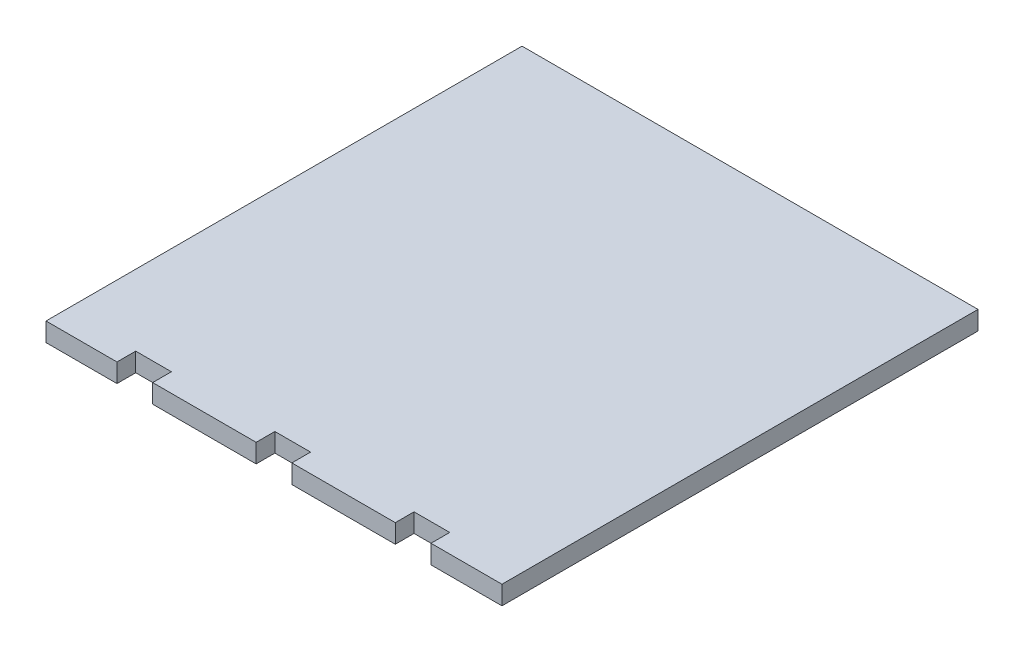
ISO-10303-21;
HEADER;
FILE_DESCRIPTION(('STEP AP214'),'2;1');
FILE_NAME('part.step','',(''),(''),'','','');
FILE_SCHEMA(('AUTOMOTIVE_DESIGN { 1 0 10303 214 1 1 1 1 }'));
ENDSEC;
DATA;
#1=APPLICATION_CONTEXT('core data for automotive mechanical design processes');
#2=APPLICATION_PROTOCOL_DEFINITION('international standard','automotive_design',2000,#1);
#3=PRODUCT_CONTEXT('',#1,'mechanical');
#4=PRODUCT('Part','Part','',(#3));
#5=PRODUCT_RELATED_PRODUCT_CATEGORY('part','',(#4));
#6=PRODUCT_DEFINITION_FORMATION('','',#4);
#7=PRODUCT_DEFINITION_CONTEXT('part definition',#1,'design');
#8=PRODUCT_DEFINITION('design','',#6,#7);
#9=PRODUCT_DEFINITION_SHAPE('','',#8);
#10=(LENGTH_UNIT() NAMED_UNIT(*) SI_UNIT(.MILLI.,.METRE.));
#11=(NAMED_UNIT(*) PLANE_ANGLE_UNIT() SI_UNIT($,.RADIAN.));
#12=(NAMED_UNIT(*) SI_UNIT($,.STERADIAN.) SOLID_ANGLE_UNIT());
#13=UNCERTAINTY_MEASURE_WITH_UNIT(LENGTH_MEASURE(1.E-05),#10,'distance_accuracy_value','');
#14=(GEOMETRIC_REPRESENTATION_CONTEXT(3) GLOBAL_UNCERTAINTY_ASSIGNED_CONTEXT((#13)) GLOBAL_UNIT_ASSIGNED_CONTEXT((#10,
#11,#12)) REPRESENTATION_CONTEXT('',''));
#15=CARTESIAN_POINT('',(0.,0.,0.));
#16=DIRECTION('',(0.,0.,1.));
#17=DIRECTION('',(1.,0.,0.));
#18=AXIS2_PLACEMENT_3D('',#15,#16,#17);
#19=CARTESIAN_POINT('',(-72.9868329804617,44.8,215.899999999976));
#20=DIRECTION('',(0.,0.,1.));
#21=DIRECTION('',(1.,0.,0.));
#22=AXIS2_PLACEMENT_3D('',#19,#20,#21);
#23=PLANE('',#22);
#24=DIRECTION('',(0.,1.,0.));
#25=VECTOR('',#24,1.);
#26=CARTESIAN_POINT('',(-38.8373083635468,31.8908985595305,215.899999999976));
#27=LINE('',#26,#25);
#28=CARTESIAN_POINT('',(-38.8373083635468,44.8,215.899999999976));
#29=VERTEX_POINT('',#28);
#30=CARTESIAN_POINT('',(-38.8373083635468,50.8,215.899999999976));
#31=VERTEX_POINT('',#30);
#32=EDGE_CURVE('E172',#29,#31,#27,.T.);
#33=ORIENTED_EDGE('',*,*,#32,.F.);
#34=DIRECTION('',(1.,0.,0.));
#35=VECTOR('',#34,1.);
#36=CARTESIAN_POINT('',(-72.9868329804617,44.8,215.899999999976));
#37=LINE('',#36,#35);
#38=CARTESIAN_POINT('',(-5.715,44.8,215.899999999948));
#39=VERTEX_POINT('',#38);
#40=EDGE_CURVE('E203',#29,#39,#37,.T.);
#41=ORIENTED_EDGE('',*,*,#40,.T.);
#42=DIRECTION('',(0.,1.,0.));
#43=VECTOR('',#42,1.);
#44=CARTESIAN_POINT('',(-5.715,31.8908985595305,215.899999999948));
#45=LINE('',#44,#43);
#46=CARTESIAN_POINT('',(-5.715,50.8,215.899999999948));
#47=VERTEX_POINT('',#46);
#48=EDGE_CURVE('E226',#39,#47,#45,.T.);
#49=ORIENTED_EDGE('',*,*,#48,.T.);
#50=DIRECTION('',(1.,0.,0.));
#51=VECTOR('',#50,1.);
#52=CARTESIAN_POINT('',(-72.9868329804617,50.8,215.899999999976));
#53=LINE('',#52,#51);
#54=EDGE_CURVE('E180',#31,#47,#53,.T.);
#55=ORIENTED_EDGE('',*,*,#54,.F.);
#56=EDGE_LOOP('',(#33,#41,#49,#55));
#57=FACE_BOUND('',#56,.T.);
#58=ADVANCED_FACE('F39',(#57),#23,.T.);
#59=DIRECTION('',(0.,1.,0.));
#60=VECTOR('',#59,1.);
#61=CARTESIAN_POINT('',(50.2673083635468,31.8908985595305,215.899999999948));
#62=LINE('',#61,#60);
#63=CARTESIAN_POINT('',(50.2673083635468,44.8,215.899999999948));
#64=VERTEX_POINT('',#63);
#65=CARTESIAN_POINT('',(50.2673083635468,50.8,215.899999999948));
#66=VERTEX_POINT('',#65);
#67=EDGE_CURVE('E234',#64,#66,#62,.T.);
#68=ORIENTED_EDGE('',*,*,#67,.F.);
#69=CARTESIAN_POINT('',(72.9868329804617,44.8,215.899999999976));
#70=VERTEX_POINT('',#69);
#71=EDGE_CURVE('E204',#64,#70,#37,.T.);
#72=ORIENTED_EDGE('',*,*,#71,.T.);
#73=DIRECTION('',(0.,1.,0.));
#74=VECTOR('',#73,1.);
#75=CARTESIAN_POINT('',(72.9868329804617,44.8,215.899999999976));
#76=LINE('',#75,#74);
#77=CARTESIAN_POINT('',(72.9868329804617,50.8,215.899999999976));
#78=VERTEX_POINT('',#77);
#79=EDGE_CURVE('E285',#70,#78,#76,.T.);
#80=ORIENTED_EDGE('',*,*,#79,.T.);
#81=EDGE_CURVE('E182',#66,#78,#53,.T.);
#82=ORIENTED_EDGE('',*,*,#81,.F.);
#83=EDGE_LOOP('',(#68,#72,#80,#82));
#84=FACE_BOUND('',#83,.T.);
#85=ADVANCED_FACE('F284',(#84),#23,.T.);
#86=DIRECTION('',(0.,1.,0.));
#87=VECTOR('',#86,1.);
#88=CARTESIAN_POINT('',(38.8373083635468,31.8908985595305,215.899999999948));
#89=LINE('',#88,#87);
#90=CARTESIAN_POINT('',(38.8373083635468,44.8,215.899999999948));
#91=VERTEX_POINT('',#90);
#92=CARTESIAN_POINT('',(38.8373083635468,50.8,215.899999999948));
#93=VERTEX_POINT('',#92);
#94=EDGE_CURVE('E245',#91,#93,#89,.T.);
#95=ORIENTED_EDGE('',*,*,#94,.T.);
#96=CARTESIAN_POINT('',(5.71500000000001,50.8,215.899999999948));
#97=VERTEX_POINT('',#96);
#98=EDGE_CURVE('E187',#97,#93,#53,.T.);
#99=ORIENTED_EDGE('',*,*,#98,.F.);
#100=DIRECTION('',(0.,1.,0.));
#101=VECTOR('',#100,1.);
#102=CARTESIAN_POINT('',(5.71500000000001,31.8908985595305,215.899999999948));
#103=LINE('',#102,#101);
#104=CARTESIAN_POINT('',(5.71500000000001,44.8,215.899999999948));
#105=VERTEX_POINT('',#104);
#106=EDGE_CURVE('E224',#105,#97,#103,.T.);
#107=ORIENTED_EDGE('',*,*,#106,.F.);
#108=EDGE_CURVE('E275',#105,#91,#37,.T.);
#109=ORIENTED_EDGE('',*,*,#108,.T.);
#110=EDGE_LOOP('',(#95,#99,#107,#109));
#111=FACE_BOUND('',#110,.T.);
#112=ADVANCED_FACE('F314',(#111),#23,.T.);
#113=CARTESIAN_POINT('',(-72.9868329804617,44.8,63.4999999999755));
#114=DIRECTION('',(-1.,0.,0.));
#115=DIRECTION('',(0.,0.,1.));
#116=AXIS2_PLACEMENT_3D('',#113,#114,#115);
#117=PLANE('',#116);
#118=DIRECTION('',(0.,0.,1.));
#119=VECTOR('',#118,1.);
#120=CARTESIAN_POINT('',(-72.9868329804617,50.8,63.4999999999755));
#121=LINE('',#120,#119);
#122=CARTESIAN_POINT('',(-72.9868329804617,50.8,63.4999999999755));
#123=VERTEX_POINT('',#122);
#124=CARTESIAN_POINT('',(-72.9868329804617,50.8,215.899999999976));
#125=VERTEX_POINT('',#124);
#126=EDGE_CURVE('E178',#123,#125,#121,.T.);
#127=ORIENTED_EDGE('',*,*,#126,.F.);
#128=DIRECTION('',(0.,1.,0.));
#129=VECTOR('',#128,1.);
#130=CARTESIAN_POINT('',(-72.9868329804617,44.8,63.4999999999755));
#131=LINE('',#130,#129);
#132=CARTESIAN_POINT('',(-72.9868329804617,44.8,63.4999999999755));
#133=VERTEX_POINT('',#132);
#134=EDGE_CURVE('E11',#133,#123,#131,.T.);
#135=ORIENTED_EDGE('',*,*,#134,.F.);
#136=DIRECTION('',(0.,0.,1.));
#137=VECTOR('',#136,1.);
#138=CARTESIAN_POINT('',(-72.9868329804617,44.8,63.4999999999755));
#139=LINE('',#138,#137);
#140=CARTESIAN_POINT('',(-72.9868329804617,44.8,215.899999999976));
#141=VERTEX_POINT('',#140);
#142=EDGE_CURVE('E205',#133,#141,#139,.T.);
#143=ORIENTED_EDGE('',*,*,#142,.T.);
#144=DIRECTION('',(0.,1.,0.));
#145=VECTOR('',#144,1.);
#146=CARTESIAN_POINT('',(-72.9868329804617,44.8,215.899999999976));
#147=LINE('',#146,#145);
#148=EDGE_CURVE('E43',#141,#125,#147,.T.);
#149=ORIENTED_EDGE('',*,*,#148,.T.);
#150=EDGE_LOOP('',(#127,#135,#143,#149));
#151=FACE_BOUND('',#150,.T.);
#152=ADVANCED_FACE('F41',(#151),#117,.T.);
#153=CARTESIAN_POINT('',(-72.9868329804617,44.8,63.4999999999755));
#154=DIRECTION('',(0.,0.,-1.));
#155=DIRECTION('',(-1.,0.,0.));
#156=AXIS2_PLACEMENT_3D('',#153,#154,#155);
#157=PLANE('',#156);
#158=DIRECTION('',(-1.,0.,0.));
#159=VECTOR('',#158,1.);
#160=CARTESIAN_POINT('',(-72.9868329804617,50.8,63.4999999999755));
#161=LINE('',#160,#159);
#162=CARTESIAN_POINT('',(72.9868329804617,50.8,63.4999999999755));
#163=VERTEX_POINT('',#162);
#164=EDGE_CURVE('E184',#163,#123,#161,.T.);
#165=ORIENTED_EDGE('',*,*,#164,.F.);
#166=DIRECTION('',(0.,1.,0.));
#167=VECTOR('',#166,1.);
#168=CARTESIAN_POINT('',(72.9868329804617,44.8,63.4999999999755));
#169=LINE('',#168,#167);
#170=CARTESIAN_POINT('',(72.9868329804617,44.8,63.4999999999755));
#171=VERTEX_POINT('',#170);
#172=EDGE_CURVE('E48',#171,#163,#169,.T.);
#173=ORIENTED_EDGE('',*,*,#172,.F.);
#174=DIRECTION('',(-1.,0.,0.));
#175=VECTOR('',#174,1.);
#176=CARTESIAN_POINT('',(-72.9868329804617,44.8,63.4999999999755));
#177=LINE('',#176,#175);
#178=EDGE_CURVE('E196',#171,#133,#177,.T.);
#179=ORIENTED_EDGE('',*,*,#178,.T.);
#180=ORIENTED_EDGE('',*,*,#134,.T.);
#181=EDGE_LOOP('',(#165,#173,#179,#180));
#182=FACE_BOUND('',#181,.T.);
#183=ADVANCED_FACE('F295',(#182),#157,.T.);
#184=CARTESIAN_POINT('',(72.9868329804617,44.8,63.4999999999755));
#185=DIRECTION('',(1.,0.,0.));
#186=DIRECTION('',(0.,0.,-1.));
#187=AXIS2_PLACEMENT_3D('',#184,#185,#186);
#188=PLANE('',#187);
#189=DIRECTION('',(0.,0.,-1.));
#190=VECTOR('',#189,1.);
#191=CARTESIAN_POINT('',(72.9868329804617,50.8,63.4999999999755));
#192=LINE('',#191,#190);
#193=EDGE_CURVE('E179',#78,#163,#192,.T.);
#194=ORIENTED_EDGE('',*,*,#193,.F.);
#195=ORIENTED_EDGE('',*,*,#79,.F.);
#196=DIRECTION('',(0.,0.,-1.));
#197=VECTOR('',#196,1.);
#198=CARTESIAN_POINT('',(72.9868329804617,44.8,63.4999999999755));
#199=LINE('',#198,#197);
#200=EDGE_CURVE('E199',#70,#171,#199,.T.);
#201=ORIENTED_EDGE('',*,*,#200,.T.);
#202=ORIENTED_EDGE('',*,*,#172,.T.);
#203=EDGE_LOOP('',(#194,#195,#201,#202));
#204=FACE_BOUND('',#203,.T.);
#205=ADVANCED_FACE('F290',(#204),#188,.T.);
#206=DIRECTION('',(0.,1.,0.));
#207=VECTOR('',#206,1.);
#208=CARTESIAN_POINT('',(-50.2673083635468,31.8908985595305,215.899999999976));
#209=LINE('',#208,#207);
#210=CARTESIAN_POINT('',(-50.2673083635468,44.8,215.899999999976));
#211=VERTEX_POINT('',#210);
#212=CARTESIAN_POINT('',(-50.2673083635468,50.8,215.899999999976));
#213=VERTEX_POINT('',#212);
#214=EDGE_CURVE('E157',#211,#213,#209,.T.);
#215=ORIENTED_EDGE('',*,*,#214,.T.);
#216=EDGE_CURVE('E168',#125,#213,#53,.T.);
#217=ORIENTED_EDGE('',*,*,#216,.F.);
#218=ORIENTED_EDGE('',*,*,#148,.F.);
#219=EDGE_CURVE('E171',#141,#211,#37,.T.);
#220=ORIENTED_EDGE('',*,*,#219,.T.);
#221=EDGE_LOOP('',(#215,#217,#218,#220));
#222=FACE_BOUND('',#221,.T.);
#223=ADVANCED_FACE('F167',(#222),#23,.T.);
#224=CARTESIAN_POINT('',(0.,44.8,0.));
#225=DIRECTION('',(0.,1.,0.));
#226=DIRECTION('',(0.,0.,1.));
#227=AXIS2_PLACEMENT_3D('',#224,#225,#226);
#228=PLANE('',#227);
#229=ORIENTED_EDGE('',*,*,#40,.F.);
#230=DIRECTION('',(0.,0.,1.));
#231=VECTOR('',#230,1.);
#232=CARTESIAN_POINT('',(-38.8373083635468,44.8,0.));
#233=LINE('',#232,#231);
#234=CARTESIAN_POINT('',(-38.8373083635468,44.8,209.899999999948));
#235=VERTEX_POINT('',#234);
#236=EDGE_CURVE('E256',#235,#29,#233,.T.);
#237=ORIENTED_EDGE('',*,*,#236,.F.);
#238=DIRECTION('',(1.,0.,0.));
#239=VECTOR('',#238,1.);
#240=CARTESIAN_POINT('',(0.,44.8,209.899999999948));
#241=LINE('',#240,#239);
#242=CARTESIAN_POINT('',(-50.2673083635468,44.8,209.899999999948));
#243=VERTEX_POINT('',#242);
#244=EDGE_CURVE('E193',#243,#235,#241,.T.);
#245=ORIENTED_EDGE('',*,*,#244,.F.);
#246=DIRECTION('',(0.,0.,-1.));
#247=VECTOR('',#246,1.);
#248=CARTESIAN_POINT('',(-50.2673083635468,44.8,0.));
#249=LINE('',#248,#247);
#250=EDGE_CURVE('E192',#211,#243,#249,.T.);
#251=ORIENTED_EDGE('',*,*,#250,.F.);
#252=ORIENTED_EDGE('',*,*,#219,.F.);
#253=ORIENTED_EDGE('',*,*,#142,.F.);
#254=ORIENTED_EDGE('',*,*,#178,.F.);
#255=ORIENTED_EDGE('',*,*,#200,.F.);
#256=ORIENTED_EDGE('',*,*,#71,.F.);
#257=DIRECTION('',(0.,0.,1.));
#258=VECTOR('',#257,1.);
#259=CARTESIAN_POINT('',(50.2673083635468,44.8,215.899999999948));
#260=LINE('',#259,#258);
#261=CARTESIAN_POINT('',(50.2673083635468,44.8,209.899999999948));
#262=VERTEX_POINT('',#261);
#263=EDGE_CURVE('E235',#262,#64,#260,.T.);
#264=ORIENTED_EDGE('',*,*,#263,.F.);
#265=DIRECTION('',(1.,0.,0.));
#266=VECTOR('',#265,1.);
#267=CARTESIAN_POINT('',(50.2673083635468,44.8,209.899999999948));
#268=LINE('',#267,#266);
#269=CARTESIAN_POINT('',(38.8373083635468,44.8,209.899999999948));
#270=VERTEX_POINT('',#269);
#271=EDGE_CURVE('E216',#270,#262,#268,.T.);
#272=ORIENTED_EDGE('',*,*,#271,.F.);
#273=DIRECTION('',(0.,0.,-1.));
#274=VECTOR('',#273,1.);
#275=CARTESIAN_POINT('',(38.8373083635468,44.8,209.899999999948));
#276=LINE('',#275,#274);
#277=EDGE_CURVE('E232',#91,#270,#276,.T.);
#278=ORIENTED_EDGE('',*,*,#277,.F.);
#279=ORIENTED_EDGE('',*,*,#108,.F.);
#280=DIRECTION('',(0.,0.,1.));
#281=VECTOR('',#280,1.);
#282=CARTESIAN_POINT('',(5.71500000000001,44.8,215.899999999948));
#283=LINE('',#282,#281);
#284=CARTESIAN_POINT('',(5.71500000000001,44.8,209.899999999948));
#285=VERTEX_POINT('',#284);
#286=EDGE_CURVE('E208',#285,#105,#283,.T.);
#287=ORIENTED_EDGE('',*,*,#286,.F.);
#288=DIRECTION('',(1.,0.,0.));
#289=VECTOR('',#288,1.);
#290=CARTESIAN_POINT('',(5.71500000000001,44.8,209.899999999948));
#291=LINE('',#290,#289);
#292=CARTESIAN_POINT('',(-5.715,44.8,209.899999999948));
#293=VERTEX_POINT('',#292);
#294=EDGE_CURVE('E211',#293,#285,#291,.T.);
#295=ORIENTED_EDGE('',*,*,#294,.F.);
#296=DIRECTION('',(0.,0.,-1.));
#297=VECTOR('',#296,1.);
#298=CARTESIAN_POINT('',(-5.715,44.8,209.899999999948));
#299=LINE('',#298,#297);
#300=EDGE_CURVE('E213',#39,#293,#299,.T.);
#301=ORIENTED_EDGE('',*,*,#300,.F.);
#302=EDGE_LOOP('',(#229,#237,#245,#251,#252,#253,#254,#255,#256,#264,#272,#278,#279,#287,#295,#301));
#303=FACE_BOUND('',#302,.T.);
#304=ADVANCED_FACE('F273',(#303),#228,.F.);
#305=CARTESIAN_POINT('',(0.,50.8,0.));
#306=DIRECTION('',(0.,1.,0.));
#307=DIRECTION('',(0.,0.,1.));
#308=AXIS2_PLACEMENT_3D('',#305,#306,#307);
#309=PLANE('',#308);
#310=DIRECTION('',(0.,0.,-1.));
#311=VECTOR('',#310,1.);
#312=CARTESIAN_POINT('',(-38.8373083635468,50.8,0.));
#313=LINE('',#312,#311);
#314=CARTESIAN_POINT('',(-38.8373083635468,50.8,209.899999999948));
#315=VERTEX_POINT('',#314);
#316=EDGE_CURVE('E162',#31,#315,#313,.T.);
#317=ORIENTED_EDGE('',*,*,#316,.F.);
#318=ORIENTED_EDGE('',*,*,#54,.T.);
#319=DIRECTION('',(0.,0.,1.));
#320=VECTOR('',#319,1.);
#321=CARTESIAN_POINT('',(-5.715,50.8,209.899999999948));
#322=LINE('',#321,#320);
#323=CARTESIAN_POINT('',(-5.715,50.8,209.899999999948));
#324=VERTEX_POINT('',#323);
#325=EDGE_CURVE('E217',#324,#47,#322,.T.);
#326=ORIENTED_EDGE('',*,*,#325,.F.);
#327=DIRECTION('',(-1.,0.,0.));
#328=VECTOR('',#327,1.);
#329=CARTESIAN_POINT('',(5.71500000000001,50.8,209.899999999948));
#330=LINE('',#329,#328);
#331=CARTESIAN_POINT('',(5.71500000000001,50.8,209.899999999948));
#332=VERTEX_POINT('',#331);
#333=EDGE_CURVE('E214',#332,#324,#330,.T.);
#334=ORIENTED_EDGE('',*,*,#333,.F.);
#335=DIRECTION('',(0.,0.,-1.));
#336=VECTOR('',#335,1.);
#337=CARTESIAN_POINT('',(5.71500000000001,50.8,215.899999999948));
#338=LINE('',#337,#336);
#339=EDGE_CURVE('E219',#97,#332,#338,.T.);
#340=ORIENTED_EDGE('',*,*,#339,.F.);
#341=ORIENTED_EDGE('',*,*,#98,.T.);
#342=DIRECTION('',(0.,0.,1.));
#343=VECTOR('',#342,1.);
#344=CARTESIAN_POINT('',(38.8373083635468,50.8,209.899999999948));
#345=LINE('',#344,#343);
#346=CARTESIAN_POINT('',(38.8373083635468,50.8,209.899999999948));
#347=VERTEX_POINT('',#346);
#348=EDGE_CURVE('E241',#347,#93,#345,.T.);
#349=ORIENTED_EDGE('',*,*,#348,.F.);
#350=DIRECTION('',(-1.,0.,0.));
#351=VECTOR('',#350,1.);
#352=CARTESIAN_POINT('',(50.2673083635468,50.8,209.899999999948));
#353=LINE('',#352,#351);
#354=CARTESIAN_POINT('',(50.2673083635468,50.8,209.899999999948));
#355=VERTEX_POINT('',#354);
#356=EDGE_CURVE('E238',#355,#347,#353,.T.);
#357=ORIENTED_EDGE('',*,*,#356,.F.);
#358=DIRECTION('',(0.,0.,-1.));
#359=VECTOR('',#358,1.);
#360=CARTESIAN_POINT('',(50.2673083635468,50.8,215.899999999948));
#361=LINE('',#360,#359);
#362=EDGE_CURVE('E64',#66,#355,#361,.T.);
#363=ORIENTED_EDGE('',*,*,#362,.F.);
#364=ORIENTED_EDGE('',*,*,#81,.T.);
#365=ORIENTED_EDGE('',*,*,#193,.T.);
#366=ORIENTED_EDGE('',*,*,#164,.T.);
#367=ORIENTED_EDGE('',*,*,#126,.T.);
#368=ORIENTED_EDGE('',*,*,#216,.T.);
#369=DIRECTION('',(0.,0.,1.));
#370=VECTOR('',#369,1.);
#371=CARTESIAN_POINT('',(-50.2673083635468,50.8,0.));
#372=LINE('',#371,#370);
#373=CARTESIAN_POINT('',(-50.2673083635468,50.8,209.899999999948));
#374=VERTEX_POINT('',#373);
#375=EDGE_CURVE('E154',#374,#213,#372,.T.);
#376=ORIENTED_EDGE('',*,*,#375,.F.);
#377=DIRECTION('',(-1.,0.,0.));
#378=VECTOR('',#377,1.);
#379=CARTESIAN_POINT('',(0.,50.8,209.899999999948));
#380=LINE('',#379,#378);
#381=EDGE_CURVE('E56',#315,#374,#380,.T.);
#382=ORIENTED_EDGE('',*,*,#381,.F.);
#383=EDGE_LOOP('',(#317,#318,#326,#334,#340,#341,#349,#357,#363,#364,#365,#366,#367,#368,#376,#382));
#384=FACE_BOUND('',#383,.T.);
#385=ADVANCED_FACE('F175',(#384),#309,.T.);
#386=CARTESIAN_POINT('',(5.71500000000001,31.8908985595305,209.899999999948));
#387=DIRECTION('',(0.,0.,-1.));
#388=DIRECTION('',(-1.,0.,0.));
#389=AXIS2_PLACEMENT_3D('',#386,#387,#388);
#390=PLANE('',#389);
#391=ORIENTED_EDGE('',*,*,#294,.T.);
#392=DIRECTION('',(0.,1.,0.));
#393=VECTOR('',#392,1.);
#394=CARTESIAN_POINT('',(5.71500000000001,31.8908985595305,209.899999999948));
#395=LINE('',#394,#393);
#396=EDGE_CURVE('E210',#285,#332,#395,.T.);
#397=ORIENTED_EDGE('',*,*,#396,.T.);
#398=ORIENTED_EDGE('',*,*,#333,.T.);
#399=DIRECTION('',(0.,1.,0.));
#400=VECTOR('',#399,1.);
#401=CARTESIAN_POINT('',(-5.715,31.8908985595305,209.899999999948));
#402=LINE('',#401,#400);
#403=EDGE_CURVE('E222',#293,#324,#402,.T.);
#404=ORIENTED_EDGE('',*,*,#403,.F.);
#405=EDGE_LOOP('',(#391,#397,#398,#404));
#406=FACE_BOUND('',#405,.T.);
#407=ADVANCED_FACE('F307',(#406),#390,.F.);
#408=CARTESIAN_POINT('',(5.71500000000001,31.8908985595305,215.899999999948));
#409=DIRECTION('',(1.,0.,0.));
#410=DIRECTION('',(0.,0.,-1.));
#411=AXIS2_PLACEMENT_3D('',#408,#409,#410);
#412=PLANE('',#411);
#413=ORIENTED_EDGE('',*,*,#286,.T.);
#414=ORIENTED_EDGE('',*,*,#106,.T.);
#415=ORIENTED_EDGE('',*,*,#339,.T.);
#416=ORIENTED_EDGE('',*,*,#396,.F.);
#417=EDGE_LOOP('',(#413,#414,#415,#416));
#418=FACE_BOUND('',#417,.T.);
#419=ADVANCED_FACE('F312',(#418),#412,.F.);
#420=CARTESIAN_POINT('',(-5.715,31.8908985595305,209.899999999948));
#421=DIRECTION('',(-1.,0.,0.));
#422=DIRECTION('',(0.,0.,1.));
#423=AXIS2_PLACEMENT_3D('',#420,#421,#422);
#424=PLANE('',#423);
#425=ORIENTED_EDGE('',*,*,#300,.T.);
#426=ORIENTED_EDGE('',*,*,#403,.T.);
#427=ORIENTED_EDGE('',*,*,#325,.T.);
#428=ORIENTED_EDGE('',*,*,#48,.F.);
#429=EDGE_LOOP('',(#425,#426,#427,#428));
#430=FACE_BOUND('',#429,.T.);
#431=ADVANCED_FACE('F304',(#430),#424,.F.);
#432=CARTESIAN_POINT('',(50.2673083635468,31.8908985595305,215.899999999948));
#433=DIRECTION('',(1.,0.,0.));
#434=DIRECTION('',(0.,0.,-1.));
#435=AXIS2_PLACEMENT_3D('',#432,#433,#434);
#436=PLANE('',#435);
#437=ORIENTED_EDGE('',*,*,#263,.T.);
#438=ORIENTED_EDGE('',*,*,#67,.T.);
#439=ORIENTED_EDGE('',*,*,#362,.T.);
#440=DIRECTION('',(0.,1.,0.));
#441=VECTOR('',#440,1.);
#442=CARTESIAN_POINT('',(50.2673083635468,31.8908985595305,209.899999999948));
#443=LINE('',#442,#441);
#444=EDGE_CURVE('E243',#262,#355,#443,.T.);
#445=ORIENTED_EDGE('',*,*,#444,.F.);
#446=EDGE_LOOP('',(#437,#438,#439,#445));
#447=FACE_BOUND('',#446,.T.);
#448=ADVANCED_FACE('F323',(#447),#436,.F.);
#449=CARTESIAN_POINT('',(38.8373083635468,31.8908985595305,209.899999999948));
#450=DIRECTION('',(-1.,0.,0.));
#451=DIRECTION('',(0.,0.,1.));
#452=AXIS2_PLACEMENT_3D('',#449,#450,#451);
#453=PLANE('',#452);
#454=ORIENTED_EDGE('',*,*,#277,.T.);
#455=DIRECTION('',(0.,1.,0.));
#456=VECTOR('',#455,1.);
#457=CARTESIAN_POINT('',(38.8373083635468,31.8908985595305,209.899999999948));
#458=LINE('',#457,#456);
#459=EDGE_CURVE('E248',#270,#347,#458,.T.);
#460=ORIENTED_EDGE('',*,*,#459,.T.);
#461=ORIENTED_EDGE('',*,*,#348,.T.);
#462=ORIENTED_EDGE('',*,*,#94,.F.);
#463=EDGE_LOOP('',(#454,#460,#461,#462));
#464=FACE_BOUND('',#463,.T.);
#465=ADVANCED_FACE('F318',(#464),#453,.F.);
#466=CARTESIAN_POINT('',(50.2673083635468,31.8908985595305,209.899999999948));
#467=DIRECTION('',(0.,0.,-1.));
#468=DIRECTION('',(-1.,0.,0.));
#469=AXIS2_PLACEMENT_3D('',#466,#467,#468);
#470=PLANE('',#469);
#471=ORIENTED_EDGE('',*,*,#271,.T.);
#472=ORIENTED_EDGE('',*,*,#444,.T.);
#473=ORIENTED_EDGE('',*,*,#356,.T.);
#474=ORIENTED_EDGE('',*,*,#459,.F.);
#475=EDGE_LOOP('',(#471,#472,#473,#474));
#476=FACE_BOUND('',#475,.T.);
#477=ADVANCED_FACE('F322',(#476),#470,.F.);
#478=CARTESIAN_POINT('',(0.,31.8908985595305,209.899999999948));
#479=DIRECTION('',(0.,0.,-1.));
#480=DIRECTION('',(-1.,0.,0.));
#481=AXIS2_PLACEMENT_3D('',#478,#479,#480);
#482=PLANE('',#481);
#483=ORIENTED_EDGE('',*,*,#244,.T.);
#484=DIRECTION('',(0.,1.,0.));
#485=VECTOR('',#484,1.);
#486=CARTESIAN_POINT('',(-38.8373083635468,31.8908985595305,209.899999999948));
#487=LINE('',#486,#485);
#488=EDGE_CURVE('E254',#235,#315,#487,.T.);
#489=ORIENTED_EDGE('',*,*,#488,.T.);
#490=ORIENTED_EDGE('',*,*,#381,.T.);
#491=DIRECTION('',(0.,1.,0.));
#492=VECTOR('',#491,1.);
#493=CARTESIAN_POINT('',(-50.2673083635468,31.8908985595305,209.899999999948));
#494=LINE('',#493,#492);
#495=EDGE_CURVE('E159',#243,#374,#494,.T.);
#496=ORIENTED_EDGE('',*,*,#495,.F.);
#497=EDGE_LOOP('',(#483,#489,#490,#496));
#498=FACE_BOUND('',#497,.T.);
#499=ADVANCED_FACE('F299',(#498),#482,.F.);
#500=CARTESIAN_POINT('',(-38.8373083635468,31.8908985595305,0.));
#501=DIRECTION('',(1.,0.,0.));
#502=DIRECTION('',(0.,0.,-1.));
#503=AXIS2_PLACEMENT_3D('',#500,#501,#502);
#504=PLANE('',#503);
#505=ORIENTED_EDGE('',*,*,#236,.T.);
#506=ORIENTED_EDGE('',*,*,#32,.T.);
#507=ORIENTED_EDGE('',*,*,#316,.T.);
#508=ORIENTED_EDGE('',*,*,#488,.F.);
#509=EDGE_LOOP('',(#505,#506,#507,#508));
#510=FACE_BOUND('',#509,.T.);
#511=ADVANCED_FACE('F265',(#510),#504,.F.);
#512=CARTESIAN_POINT('',(-50.2673083635468,31.8908985595305,0.));
#513=DIRECTION('',(-1.,0.,0.));
#514=DIRECTION('',(0.,0.,1.));
#515=AXIS2_PLACEMENT_3D('',#512,#513,#514);
#516=PLANE('',#515);
#517=ORIENTED_EDGE('',*,*,#250,.T.);
#518=ORIENTED_EDGE('',*,*,#495,.T.);
#519=ORIENTED_EDGE('',*,*,#375,.T.);
#520=ORIENTED_EDGE('',*,*,#214,.F.);
#521=EDGE_LOOP('',(#517,#518,#519,#520));
#522=FACE_BOUND('',#521,.T.);
#523=ADVANCED_FACE('F156',(#522),#516,.F.);
#524=CLOSED_SHELL('',(#58,#85,#112,#152,#183,#205,#223,#304,#385,#407,#419,#431,#448,#465,#477,
#499,#511,#523));
#525=MANIFOLD_SOLID_BREP('B2',#524);
#526=ADVANCED_BREP_SHAPE_REPRESENTATION('',(#18,#525),#14);
#527=SHAPE_DEFINITION_REPRESENTATION(#9,#526);
ENDSEC;
END-ISO-10303-21;
